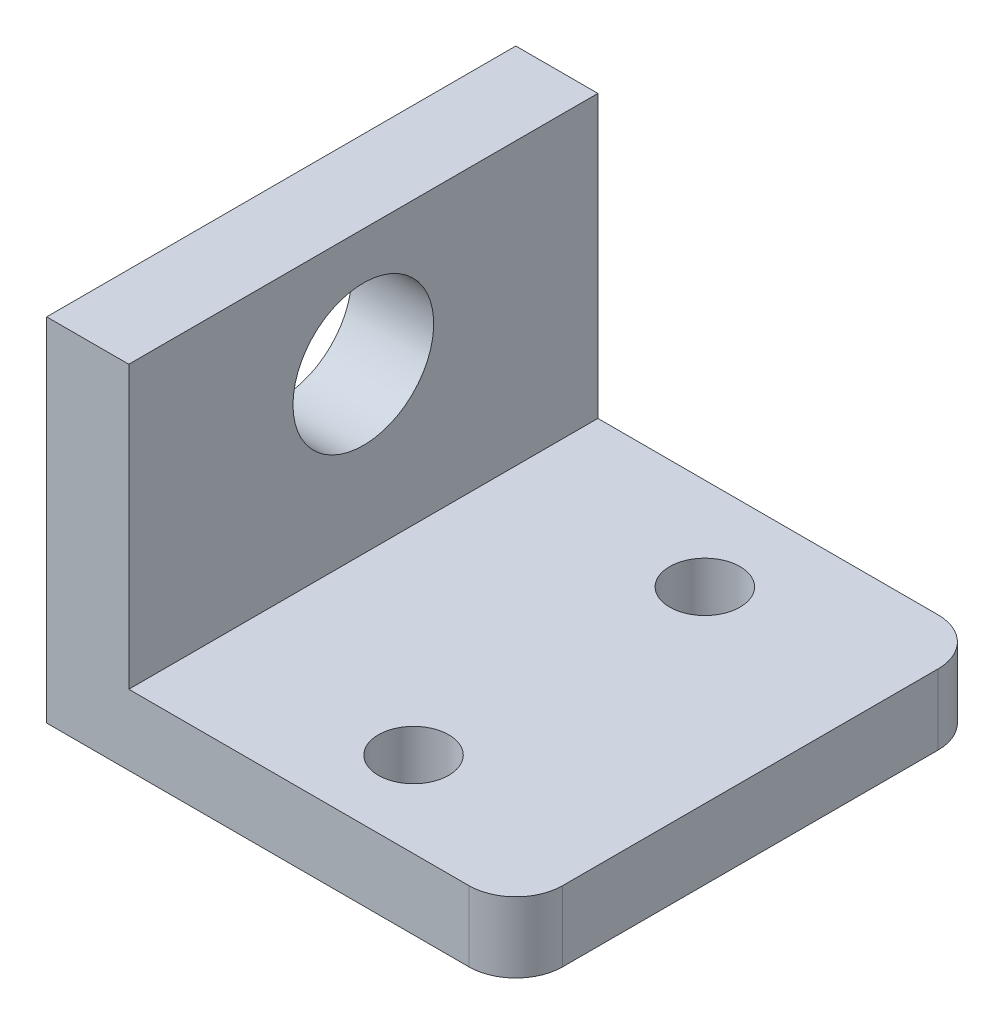
ISO-10303-21;
HEADER;
FILE_DESCRIPTION(('STEP AP214'),'2;1');
FILE_NAME('part.step','',(''),(''),'','','');
FILE_SCHEMA(('AUTOMOTIVE_DESIGN { 1 0 10303 214 1 1 1 1 }'));
ENDSEC;
DATA;
#1=APPLICATION_CONTEXT('core data for automotive mechanical design processes');
#2=APPLICATION_PROTOCOL_DEFINITION('international standard','automotive_design',2000,#1);
#3=PRODUCT_CONTEXT('',#1,'mechanical');
#4=PRODUCT('Part','Part','',(#3));
#5=PRODUCT_RELATED_PRODUCT_CATEGORY('part','',(#4));
#6=PRODUCT_DEFINITION_FORMATION('','',#4);
#7=PRODUCT_DEFINITION_CONTEXT('part definition',#1,'design');
#8=PRODUCT_DEFINITION('design','',#6,#7);
#9=PRODUCT_DEFINITION_SHAPE('','',#8);
#10=(LENGTH_UNIT() NAMED_UNIT(*) SI_UNIT(.MILLI.,.METRE.));
#11=(NAMED_UNIT(*) PLANE_ANGLE_UNIT() SI_UNIT($,.RADIAN.));
#12=(NAMED_UNIT(*) SI_UNIT($,.STERADIAN.) SOLID_ANGLE_UNIT());
#13=UNCERTAINTY_MEASURE_WITH_UNIT(LENGTH_MEASURE(1.E-05),#10,'distance_accuracy_value','');
#14=(GEOMETRIC_REPRESENTATION_CONTEXT(3) GLOBAL_UNCERTAINTY_ASSIGNED_CONTEXT((#13)) GLOBAL_UNIT_ASSIGNED_CONTEXT((#10,
#11,#12)) REPRESENTATION_CONTEXT('',''));
#15=CARTESIAN_POINT('',(0.,0.,0.));
#16=DIRECTION('',(0.,0.,1.));
#17=DIRECTION('',(1.,0.,0.));
#18=AXIS2_PLACEMENT_3D('',#15,#16,#17);
#19=CARTESIAN_POINT('',(-10.,3.,10.));
#20=DIRECTION('',(1.,0.,0.));
#21=DIRECTION('',(0.,0.,-1.));
#22=AXIS2_PLACEMENT_3D('',#19,#20,#21);
#23=PLANE('',#22);
#24=CARTESIAN_POINT('',(-10.,10.,0.));
#25=DIRECTION('',(-1.,0.,0.));
#26=DIRECTION('',(0.,0.,1.));
#27=AXIS2_PLACEMENT_3D('',#24,#25,#26);
#28=CIRCLE('',#27,3.);
#29=CARTESIAN_POINT('',(-10.,10.,3.));
#30=VERTEX_POINT('',#29);
#31=EDGE_CURVE('E133',#30,#30,#28,.T.);
#32=ORIENTED_EDGE('',*,*,#31,.F.);
#33=EDGE_LOOP('',(#32));
#34=FACE_BOUND('',#33,.T.);
#35=DIRECTION('',(0.,0.,1.));
#36=VECTOR('',#35,1.);
#37=CARTESIAN_POINT('',(-10.,0.,10.));
#38=LINE('',#37,#36);
#39=CARTESIAN_POINT('',(-10.,0.,-10.));
#40=VERTEX_POINT('',#39);
#41=CARTESIAN_POINT('',(-10.,0.,10.));
#42=VERTEX_POINT('',#41);
#43=EDGE_CURVE('E110',#40,#42,#38,.T.);
#44=ORIENTED_EDGE('',*,*,#43,.T.);
#45=DIRECTION('',(0.,-1.,0.));
#46=VECTOR('',#45,1.);
#47=CARTESIAN_POINT('',(-10.,3.,10.));
#48=LINE('',#47,#46);
#49=CARTESIAN_POINT('',(-10.,15.,10.));
#50=VERTEX_POINT('',#49);
#51=EDGE_CURVE('E104',#50,#42,#48,.T.);
#52=ORIENTED_EDGE('',*,*,#51,.F.);
#53=DIRECTION('',(0.,0.,1.));
#54=VECTOR('',#53,1.);
#55=CARTESIAN_POINT('',(-10.,15.,10.));
#56=LINE('',#55,#54);
#57=CARTESIAN_POINT('',(-10.,15.,-10.));
#58=VERTEX_POINT('',#57);
#59=EDGE_CURVE('E108',#58,#50,#56,.T.);
#60=ORIENTED_EDGE('',*,*,#59,.F.);
#61=DIRECTION('',(0.,-1.,0.));
#62=VECTOR('',#61,1.);
#63=CARTESIAN_POINT('',(-10.,3.,-10.));
#64=LINE('',#63,#62);
#65=EDGE_CURVE('E112',#58,#40,#64,.T.);
#66=ORIENTED_EDGE('',*,*,#65,.T.);
#67=EDGE_LOOP('',(#44,#52,#60,#66));
#68=FACE_BOUND('',#67,.T.);
#69=ADVANCED_FACE('F33',(#34,#68),#23,.F.);
#70=CARTESIAN_POINT('',(10.,3.,10.));
#71=DIRECTION('',(0.,0.,-1.));
#72=DIRECTION('',(-1.,0.,0.));
#73=AXIS2_PLACEMENT_3D('',#70,#71,#72);
#74=PLANE('',#73);
#75=DIRECTION('',(1.,0.,0.));
#76=VECTOR('',#75,1.);
#77=CARTESIAN_POINT('',(10.,0.,10.));
#78=LINE('',#77,#76);
#79=CARTESIAN_POINT('',(8.,0.,10.));
#80=VERTEX_POINT('',#79);
#81=EDGE_CURVE('E150',#42,#80,#78,.T.);
#82=ORIENTED_EDGE('',*,*,#81,.T.);
#83=DIRECTION('',(0.,-1.,0.));
#84=VECTOR('',#83,1.);
#85=CARTESIAN_POINT('',(8.,3.,10.));
#86=LINE('',#85,#84);
#87=CARTESIAN_POINT('',(8.,3.,10.));
#88=VERTEX_POINT('',#87);
#89=EDGE_CURVE('E58',#80,#88,#86,.F.);
#90=ORIENTED_EDGE('',*,*,#89,.T.);
#91=DIRECTION('',(1.,0.,0.));
#92=VECTOR('',#91,1.);
#93=CARTESIAN_POINT('',(10.,3.,10.));
#94=LINE('',#93,#92);
#95=CARTESIAN_POINT('',(-6.5,3.,10.));
#96=VERTEX_POINT('',#95);
#97=EDGE_CURVE('E142',#96,#88,#94,.T.);
#98=ORIENTED_EDGE('',*,*,#97,.F.);
#99=DIRECTION('',(0.,-1.,0.));
#100=VECTOR('',#99,1.);
#101=CARTESIAN_POINT('',(-6.5,15.,10.));
#102=LINE('',#101,#100);
#103=CARTESIAN_POINT('',(-6.5,15.,10.));
#104=VERTEX_POINT('',#103);
#105=EDGE_CURVE('E118',#104,#96,#102,.T.);
#106=ORIENTED_EDGE('',*,*,#105,.F.);
#107=DIRECTION('',(1.,0.,0.));
#108=VECTOR('',#107,1.);
#109=CARTESIAN_POINT('',(-10.,15.,10.));
#110=LINE('',#109,#108);
#111=EDGE_CURVE('E115',#50,#104,#110,.T.);
#112=ORIENTED_EDGE('',*,*,#111,.F.);
#113=ORIENTED_EDGE('',*,*,#51,.T.);
#114=EDGE_LOOP('',(#82,#90,#98,#106,#112,#113));
#115=FACE_BOUND('',#114,.T.);
#116=ADVANCED_FACE('F116',(#115),#74,.F.);
#117=CARTESIAN_POINT('',(10.,3.,10.));
#118=DIRECTION('',(-1.,0.,0.));
#119=DIRECTION('',(0.,0.,1.));
#120=AXIS2_PLACEMENT_3D('',#117,#118,#119);
#121=PLANE('',#120);
#122=DIRECTION('',(0.,0.,-1.));
#123=VECTOR('',#122,1.);
#124=CARTESIAN_POINT('',(10.,3.,10.));
#125=LINE('',#124,#123);
#126=CARTESIAN_POINT('',(10.,3.,8.));
#127=VERTEX_POINT('',#126);
#128=CARTESIAN_POINT('',(10.,3.,-8.));
#129=VERTEX_POINT('',#128);
#130=EDGE_CURVE('E144',#127,#129,#125,.T.);
#131=ORIENTED_EDGE('',*,*,#130,.F.);
#132=DIRECTION('',(0.,-1.,0.));
#133=VECTOR('',#132,1.);
#134=CARTESIAN_POINT('',(10.,3.,8.));
#135=LINE('',#134,#133);
#136=CARTESIAN_POINT('',(10.,0.,8.));
#137=VERTEX_POINT('',#136);
#138=EDGE_CURVE('E160',#127,#137,#135,.T.);
#139=ORIENTED_EDGE('',*,*,#138,.T.);
#140=DIRECTION('',(0.,0.,-1.));
#141=VECTOR('',#140,1.);
#142=CARTESIAN_POINT('',(10.,0.,10.));
#143=LINE('',#142,#141);
#144=CARTESIAN_POINT('',(10.,0.,-8.));
#145=VERTEX_POINT('',#144);
#146=EDGE_CURVE('E152',#137,#145,#143,.T.);
#147=ORIENTED_EDGE('',*,*,#146,.T.);
#148=DIRECTION('',(0.,-1.,0.));
#149=VECTOR('',#148,1.);
#150=CARTESIAN_POINT('',(10.,3.,-8.));
#151=LINE('',#150,#149);
#152=EDGE_CURVE('E111',#145,#129,#151,.F.);
#153=ORIENTED_EDGE('',*,*,#152,.T.);
#154=EDGE_LOOP('',(#131,#139,#147,#153));
#155=FACE_BOUND('',#154,.T.);
#156=ADVANCED_FACE('F199',(#155),#121,.F.);
#157=CARTESIAN_POINT('',(10.,3.,-10.));
#158=DIRECTION('',(0.,0.,1.));
#159=DIRECTION('',(1.,0.,0.));
#160=AXIS2_PLACEMENT_3D('',#157,#158,#159);
#161=PLANE('',#160);
#162=DIRECTION('',(-1.,0.,0.));
#163=VECTOR('',#162,1.);
#164=CARTESIAN_POINT('',(10.,3.,-10.));
#165=LINE('',#164,#163);
#166=CARTESIAN_POINT('',(8.,3.,-10.));
#167=VERTEX_POINT('',#166);
#168=CARTESIAN_POINT('',(-6.5,3.,-10.));
#169=VERTEX_POINT('',#168);
#170=EDGE_CURVE('E147',#167,#169,#165,.T.);
#171=ORIENTED_EDGE('',*,*,#170,.F.);
#172=DIRECTION('',(0.,-1.,0.));
#173=VECTOR('',#172,1.);
#174=CARTESIAN_POINT('',(8.,3.,-10.));
#175=LINE('',#174,#173);
#176=CARTESIAN_POINT('',(8.,0.,-10.));
#177=VERTEX_POINT('',#176);
#178=EDGE_CURVE('E11',#167,#177,#175,.T.);
#179=ORIENTED_EDGE('',*,*,#178,.T.);
#180=DIRECTION('',(-1.,0.,0.));
#181=VECTOR('',#180,1.);
#182=CARTESIAN_POINT('',(10.,0.,-10.));
#183=LINE('',#182,#181);
#184=EDGE_CURVE('E145',#177,#40,#183,.T.);
#185=ORIENTED_EDGE('',*,*,#184,.T.);
#186=ORIENTED_EDGE('',*,*,#65,.F.);
#187=DIRECTION('',(-1.,0.,0.));
#188=VECTOR('',#187,1.);
#189=CARTESIAN_POINT('',(-10.,15.,-10.));
#190=LINE('',#189,#188);
#191=CARTESIAN_POINT('',(-6.5,15.,-10.));
#192=VERTEX_POINT('',#191);
#193=EDGE_CURVE('E126',#192,#58,#190,.T.);
#194=ORIENTED_EDGE('',*,*,#193,.F.);
#195=DIRECTION('',(0.,-1.,0.));
#196=VECTOR('',#195,1.);
#197=CARTESIAN_POINT('',(-6.5,15.,-10.));
#198=LINE('',#197,#196);
#199=EDGE_CURVE('E137',#192,#169,#198,.T.);
#200=ORIENTED_EDGE('',*,*,#199,.T.);
#201=EDGE_LOOP('',(#171,#179,#185,#186,#194,#200));
#202=FACE_BOUND('',#201,.T.);
#203=ADVANCED_FACE('F189',(#202),#161,.F.);
#204=CARTESIAN_POINT('',(0.,3.,0.));
#205=DIRECTION('',(0.,1.,0.));
#206=DIRECTION('',(0.,0.,1.));
#207=AXIS2_PLACEMENT_3D('',#204,#205,#206);
#208=PLANE('',#207);
#209=CARTESIAN_POINT('',(2.,3.,-6.06016680321839));
#210=DIRECTION('',(0.,1.,0.));
#211=DIRECTION('',(0.,0.,1.));
#212=AXIS2_PLACEMENT_3D('',#209,#210,#211);
#213=CIRCLE('',#212,1.5);
#214=CARTESIAN_POINT('',(2.,3.,-4.56016680321839));
#215=VERTEX_POINT('',#214);
#216=EDGE_CURVE('E171',#215,#215,#213,.T.);
#217=ORIENTED_EDGE('',*,*,#216,.F.);
#218=EDGE_LOOP('',(#217));
#219=FACE_BOUND('',#218,.T.);
#220=CARTESIAN_POINT('',(2.,3.,6.35984538139958));
#221=DIRECTION('',(0.,1.,0.));
#222=DIRECTION('',(0.,0.,1.));
#223=AXIS2_PLACEMENT_3D('',#220,#221,#222);
#224=CIRCLE('',#223,1.5);
#225=CARTESIAN_POINT('',(2.,3.,7.85984538139958));
#226=VERTEX_POINT('',#225);
#227=EDGE_CURVE('E176',#226,#226,#224,.T.);
#228=ORIENTED_EDGE('',*,*,#227,.F.);
#229=EDGE_LOOP('',(#228));
#230=FACE_BOUND('',#229,.T.);
#231=ORIENTED_EDGE('',*,*,#97,.T.);
#232=CARTESIAN_POINT('',(8.,3.,8.));
#233=DIRECTION('',(0.,1.,0.));
#234=DIRECTION('',(0.,0.,1.));
#235=AXIS2_PLACEMENT_3D('',#232,#233,#234);
#236=CIRCLE('',#235,2.);
#237=EDGE_CURVE('E42',#88,#127,#236,.T.);
#238=ORIENTED_EDGE('',*,*,#237,.T.);
#239=ORIENTED_EDGE('',*,*,#130,.T.);
#240=CARTESIAN_POINT('',(8.,3.,-8.));
#241=DIRECTION('',(0.,1.,0.));
#242=DIRECTION('',(0.,0.,1.));
#243=AXIS2_PLACEMENT_3D('',#240,#241,#242);
#244=CIRCLE('',#243,2.);
#245=EDGE_CURVE('E50',#129,#167,#244,.T.);
#246=ORIENTED_EDGE('',*,*,#245,.T.);
#247=ORIENTED_EDGE('',*,*,#170,.T.);
#248=DIRECTION('',(0.,0.,-1.));
#249=VECTOR('',#248,1.);
#250=CARTESIAN_POINT('',(-6.5,3.,10.));
#251=LINE('',#250,#249);
#252=EDGE_CURVE('E127',#96,#169,#251,.T.);
#253=ORIENTED_EDGE('',*,*,#252,.F.);
#254=EDGE_LOOP('',(#231,#238,#239,#246,#247,#253));
#255=FACE_BOUND('',#254,.T.);
#256=ADVANCED_FACE('F186',(#219,#230,#255),#208,.T.);
#257=CARTESIAN_POINT('',(0.,0.,0.));
#258=DIRECTION('',(0.,1.,0.));
#259=DIRECTION('',(0.,0.,1.));
#260=AXIS2_PLACEMENT_3D('',#257,#258,#259);
#261=PLANE('',#260);
#262=CARTESIAN_POINT('',(2.,0.,-6.06016680321839));
#263=DIRECTION('',(0.,1.,0.));
#264=DIRECTION('',(0.,0.,1.));
#265=AXIS2_PLACEMENT_3D('',#262,#263,#264);
#266=CIRCLE('',#265,1.5);
#267=CARTESIAN_POINT('',(2.,0.,-4.56016680321839));
#268=VERTEX_POINT('',#267);
#269=EDGE_CURVE('E37',#268,#268,#266,.T.);
#270=ORIENTED_EDGE('',*,*,#269,.T.);
#271=EDGE_LOOP('',(#270));
#272=FACE_BOUND('',#271,.T.);
#273=CARTESIAN_POINT('',(2.,0.,6.35984538139958));
#274=DIRECTION('',(0.,1.,0.));
#275=DIRECTION('',(0.,0.,1.));
#276=AXIS2_PLACEMENT_3D('',#273,#274,#275);
#277=CIRCLE('',#276,1.5);
#278=CARTESIAN_POINT('',(2.,0.,7.85984538139958));
#279=VERTEX_POINT('',#278);
#280=EDGE_CURVE('E169',#279,#279,#277,.T.);
#281=ORIENTED_EDGE('',*,*,#280,.T.);
#282=EDGE_LOOP('',(#281));
#283=FACE_BOUND('',#282,.T.);
#284=ORIENTED_EDGE('',*,*,#146,.F.);
#285=CARTESIAN_POINT('',(8.,0.,8.));
#286=DIRECTION('',(0.,1.,0.));
#287=DIRECTION('',(0.,0.,1.));
#288=AXIS2_PLACEMENT_3D('',#285,#286,#287);
#289=CIRCLE('',#288,2.);
#290=EDGE_CURVE('E165',#137,#80,#289,.F.);
#291=ORIENTED_EDGE('',*,*,#290,.T.);
#292=ORIENTED_EDGE('',*,*,#81,.F.);
#293=ORIENTED_EDGE('',*,*,#43,.F.);
#294=ORIENTED_EDGE('',*,*,#184,.F.);
#295=CARTESIAN_POINT('',(8.,0.,-8.));
#296=DIRECTION('',(0.,1.,0.));
#297=DIRECTION('',(0.,0.,1.));
#298=AXIS2_PLACEMENT_3D('',#295,#296,#297);
#299=CIRCLE('',#298,2.);
#300=EDGE_CURVE('E163',#177,#145,#299,.F.);
#301=ORIENTED_EDGE('',*,*,#300,.T.);
#302=EDGE_LOOP('',(#284,#291,#292,#293,#294,#301));
#303=FACE_BOUND('',#302,.T.);
#304=ADVANCED_FACE('F188',(#272,#283,#303),#261,.F.);
#305=CARTESIAN_POINT('',(-6.5,15.,10.));
#306=DIRECTION('',(-1.,0.,0.));
#307=DIRECTION('',(0.,0.,1.));
#308=AXIS2_PLACEMENT_3D('',#305,#306,#307);
#309=PLANE('',#308);
#310=CARTESIAN_POINT('',(-6.5,10.,0.));
#311=DIRECTION('',(-1.,0.,0.));
#312=DIRECTION('',(0.,0.,1.));
#313=AXIS2_PLACEMENT_3D('',#310,#311,#312);
#314=CIRCLE('',#313,3.);
#315=CARTESIAN_POINT('',(-6.5,10.,3.));
#316=VERTEX_POINT('',#315);
#317=EDGE_CURVE('E130',#316,#316,#314,.T.);
#318=ORIENTED_EDGE('',*,*,#317,.T.);
#319=EDGE_LOOP('',(#318));
#320=FACE_BOUND('',#319,.T.);
#321=ORIENTED_EDGE('',*,*,#252,.T.);
#322=ORIENTED_EDGE('',*,*,#199,.F.);
#323=DIRECTION('',(0.,0.,-1.));
#324=VECTOR('',#323,1.);
#325=CARTESIAN_POINT('',(-6.5,15.,10.));
#326=LINE('',#325,#324);
#327=EDGE_CURVE('E121',#104,#192,#326,.T.);
#328=ORIENTED_EDGE('',*,*,#327,.F.);
#329=ORIENTED_EDGE('',*,*,#105,.T.);
#330=EDGE_LOOP('',(#321,#322,#328,#329));
#331=FACE_BOUND('',#330,.T.);
#332=ADVANCED_FACE('F208',(#320,#331),#309,.F.);
#333=CARTESIAN_POINT('',(0.,15.,0.));
#334=DIRECTION('',(0.,-1.,0.));
#335=DIRECTION('',(0.,0.,-1.));
#336=AXIS2_PLACEMENT_3D('',#333,#334,#335);
#337=PLANE('',#336);
#338=ORIENTED_EDGE('',*,*,#59,.T.);
#339=ORIENTED_EDGE('',*,*,#111,.T.);
#340=ORIENTED_EDGE('',*,*,#327,.T.);
#341=ORIENTED_EDGE('',*,*,#193,.T.);
#342=EDGE_LOOP('',(#338,#339,#340,#341));
#343=FACE_BOUND('',#342,.T.);
#344=ADVANCED_FACE('F124',(#343),#337,.F.);
#345=CARTESIAN_POINT('',(2.,10.,0.));
#346=DIRECTION('',(-1.,0.,0.));
#347=DIRECTION('',(0.,0.,1.));
#348=AXIS2_PLACEMENT_3D('',#345,#346,#347);
#349=CYLINDRICAL_SURFACE('',#348,3.);
#350=ORIENTED_EDGE('',*,*,#31,.T.);
#351=EDGE_LOOP('',(#350));
#352=FACE_BOUND('',#351,.T.);
#353=ORIENTED_EDGE('',*,*,#317,.F.);
#354=EDGE_LOOP('',(#353));
#355=FACE_BOUND('',#354,.T.);
#356=ADVANCED_FACE('F216',(#352,#355),#349,.F.);
#357=CARTESIAN_POINT('',(8.,3.,8.));
#358=DIRECTION('',(0.,-1.,0.));
#359=DIRECTION('',(0.,0.,-1.));
#360=AXIS2_PLACEMENT_3D('',#357,#358,#359);
#361=CYLINDRICAL_SURFACE('',#360,2.);
#362=ORIENTED_EDGE('',*,*,#237,.F.);
#363=ORIENTED_EDGE('',*,*,#89,.F.);
#364=ORIENTED_EDGE('',*,*,#290,.F.);
#365=ORIENTED_EDGE('',*,*,#138,.F.);
#366=EDGE_LOOP('',(#362,#363,#364,#365));
#367=FACE_BOUND('',#366,.T.);
#368=ADVANCED_FACE('F196',(#367),#361,.T.);
#369=CARTESIAN_POINT('',(8.,3.,-8.));
#370=DIRECTION('',(0.,-1.,0.));
#371=DIRECTION('',(0.,0.,-1.));
#372=AXIS2_PLACEMENT_3D('',#369,#370,#371);
#373=CYLINDRICAL_SURFACE('',#372,2.);
#374=ORIENTED_EDGE('',*,*,#245,.F.);
#375=ORIENTED_EDGE('',*,*,#152,.F.);
#376=ORIENTED_EDGE('',*,*,#300,.F.);
#377=ORIENTED_EDGE('',*,*,#178,.F.);
#378=EDGE_LOOP('',(#374,#375,#376,#377));
#379=FACE_BOUND('',#378,.T.);
#380=ADVANCED_FACE('F35',(#379),#373,.T.);
#381=CARTESIAN_POINT('',(2.,-9.,6.35984538139958));
#382=DIRECTION('',(0.,1.,0.));
#383=DIRECTION('',(0.,0.,1.));
#384=AXIS2_PLACEMENT_3D('',#381,#382,#383);
#385=CYLINDRICAL_SURFACE('',#384,1.5);
#386=ORIENTED_EDGE('',*,*,#227,.T.);
#387=EDGE_LOOP('',(#386));
#388=FACE_BOUND('',#387,.T.);
#389=ORIENTED_EDGE('',*,*,#280,.F.);
#390=EDGE_LOOP('',(#389));
#391=FACE_BOUND('',#390,.T.);
#392=ADVANCED_FACE('F183',(#388,#391),#385,.F.);
#393=CARTESIAN_POINT('',(2.,-9.,-6.06016680321839));
#394=DIRECTION('',(0.,1.,0.));
#395=DIRECTION('',(0.,0.,1.));
#396=AXIS2_PLACEMENT_3D('',#393,#394,#395);
#397=CYLINDRICAL_SURFACE('',#396,1.5);
#398=ORIENTED_EDGE('',*,*,#216,.T.);
#399=EDGE_LOOP('',(#398));
#400=FACE_BOUND('',#399,.T.);
#401=ORIENTED_EDGE('',*,*,#269,.F.);
#402=EDGE_LOOP('',(#401));
#403=FACE_BOUND('',#402,.T.);
#404=ADVANCED_FACE('F243',(#400,#403),#397,.F.);
#405=CLOSED_SHELL('',(#69,#116,#156,#203,#256,#304,#332,#344,#356,#368,#380,#392,#404));
#406=MANIFOLD_SOLID_BREP('B2',#405);
#407=ADVANCED_BREP_SHAPE_REPRESENTATION('',(#18,#406),#14);
#408=SHAPE_DEFINITION_REPRESENTATION(#9,#407);
ENDSEC;
END-ISO-10303-21;
